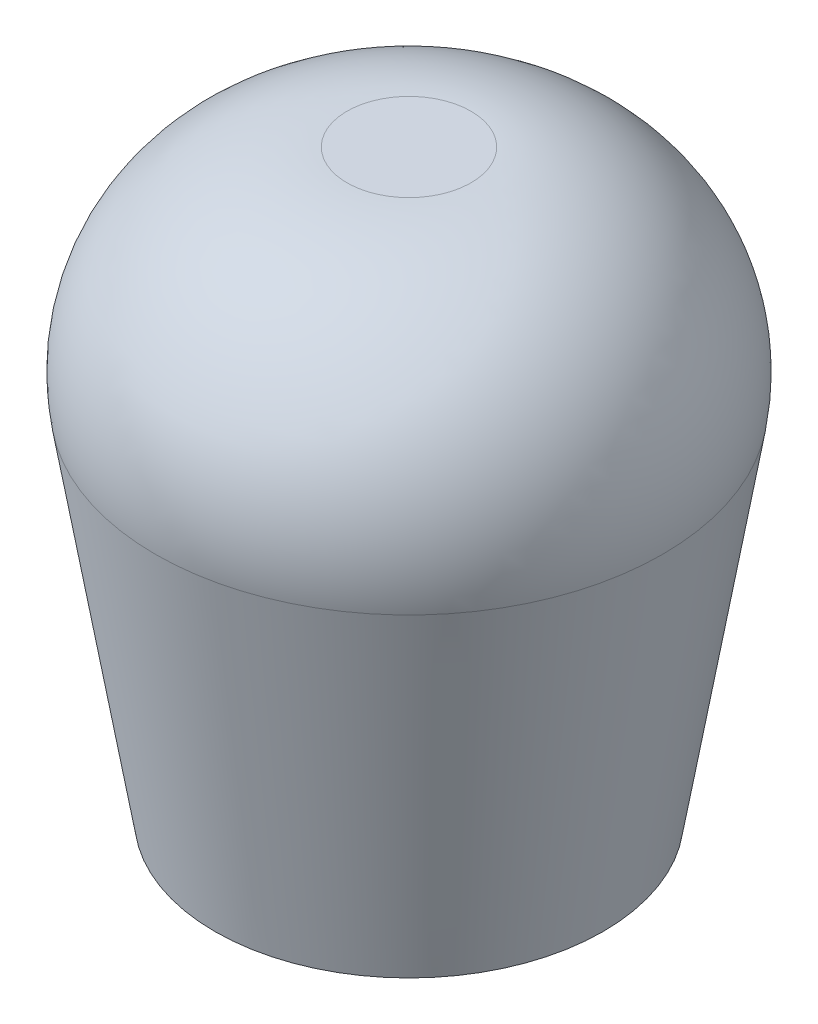
ISO-10303-21;
HEADER;
FILE_DESCRIPTION(('STEP AP214'),'2;1');
FILE_NAME('part.step','',(''),(''),'','','');
FILE_SCHEMA(('AUTOMOTIVE_DESIGN { 1 0 10303 214 1 1 1 1 }'));
ENDSEC;
DATA;
#1=APPLICATION_CONTEXT('core data for automotive mechanical design processes');
#2=APPLICATION_PROTOCOL_DEFINITION('international standard','automotive_design',2000,#1);
#3=PRODUCT_CONTEXT('',#1,'mechanical');
#4=PRODUCT('Part','Part','',(#3));
#5=PRODUCT_RELATED_PRODUCT_CATEGORY('part','',(#4));
#6=PRODUCT_DEFINITION_FORMATION('','',#4);
#7=PRODUCT_DEFINITION_CONTEXT('part definition',#1,'design');
#8=PRODUCT_DEFINITION('design','',#6,#7);
#9=PRODUCT_DEFINITION_SHAPE('','',#8);
#10=(LENGTH_UNIT() NAMED_UNIT(*) SI_UNIT(.MILLI.,.METRE.));
#11=(NAMED_UNIT(*) PLANE_ANGLE_UNIT() SI_UNIT($,.RADIAN.));
#12=(NAMED_UNIT(*) SI_UNIT($,.STERADIAN.) SOLID_ANGLE_UNIT());
#13=UNCERTAINTY_MEASURE_WITH_UNIT(LENGTH_MEASURE(1.E-05),#10,'distance_accuracy_value','');
#14=(GEOMETRIC_REPRESENTATION_CONTEXT(3) GLOBAL_UNCERTAINTY_ASSIGNED_CONTEXT((#13)) GLOBAL_UNIT_ASSIGNED_CONTEXT((#10,
#11,#12)) REPRESENTATION_CONTEXT('',''));
#15=CARTESIAN_POINT('',(0.,0.,0.));
#16=DIRECTION('',(0.,0.,1.));
#17=DIRECTION('',(1.,0.,0.));
#18=AXIS2_PLACEMENT_3D('',#15,#16,#17);
#19=CARTESIAN_POINT('',(0.,0.,0.));
#20=DIRECTION('',(0.,1.,0.));
#21=DIRECTION('',(0.,0.,1.));
#22=AXIS2_PLACEMENT_3D('',#19,#20,#21);
#23=CONICAL_SURFACE('',#22,15.,0.165148677414627);
#24=CARTESIAN_POINT('',(0.,27.5340151904196,0.));
#25=DIRECTION('',(0.,1.,0.));
#26=DIRECTION('',(0.,0.,1.));
#27=AXIS2_PLACEMENT_3D('',#24,#25,#26);
#28=CIRCLE('',#27,19.5890025317366);
#29=CARTESIAN_POINT('',(0.,27.5340151904196,19.5890025317366));
#30=VERTEX_POINT('',#29);
#31=EDGE_CURVE('E66',#30,#30,#28,.F.);
#32=ORIENTED_EDGE('',*,*,#31,.T.);
#33=EDGE_LOOP('',(#32));
#34=FACE_BOUND('',#33,.T.);
#35=CARTESIAN_POINT('',(0.,0.,0.));
#36=DIRECTION('',(0.,1.,0.));
#37=DIRECTION('',(0.,0.,1.));
#38=AXIS2_PLACEMENT_3D('',#35,#36,#37);
#39=CIRCLE('',#38,15.);
#40=CARTESIAN_POINT('',(0.,0.,15.));
#41=VERTEX_POINT('',#40);
#42=EDGE_CURVE('E70',#41,#41,#39,.F.);
#43=ORIENTED_EDGE('',*,*,#42,.F.);
#44=EDGE_LOOP('',(#43));
#45=FACE_BOUND('',#44,.T.);
#46=ADVANCED_FACE('F59',(#34,#45),#23,.T.);
#47=CARTESIAN_POINT('',(0.,45.,0.));
#48=DIRECTION('',(0.,-1.,0.));
#49=DIRECTION('',(0.,0.,-1.));
#50=AXIS2_PLACEMENT_3D('',#47,#48,#49);
#51=PLANE('',#50);
#52=CARTESIAN_POINT('',(0.,45.,0.));
#53=DIRECTION('',(0.,-1.,0.));
#54=DIRECTION('',(0.,0.,-1.));
#55=AXIS2_PLACEMENT_3D('',#52,#53,#54);
#56=CIRCLE('',#55,4.79309367425445);
#57=CARTESIAN_POINT('',(0.,45.,-4.79309367425445));
#58=VERTEX_POINT('',#57);
#59=EDGE_CURVE('E11',#58,#58,#56,.F.);
#60=ORIENTED_EDGE('',*,*,#59,.T.);
#61=EDGE_LOOP('',(#60));
#62=FACE_BOUND('',#61,.T.);
#63=ADVANCED_FACE('F92',(#62),#51,.F.);
#64=CARTESIAN_POINT('',(0.,0.,0.));
#65=DIRECTION('',(0.,-1.,0.));
#66=DIRECTION('',(0.,0.,-1.));
#67=AXIS2_PLACEMENT_3D('',#64,#65,#66);
#68=PLANE('',#67);
#69=CARTESIAN_POINT('',(0.,0.,0.));
#70=DIRECTION('',(0.,-1.,0.));
#71=DIRECTION('',(0.,0.,-1.));
#72=AXIS2_PLACEMENT_3D('',#69,#70,#71);
#73=CIRCLE('',#72,7.5);
#74=CARTESIAN_POINT('',(0.,0.,-7.5));
#75=VERTEX_POINT('',#74);
#76=EDGE_CURVE('E110',#75,#75,#73,.T.);
#77=ORIENTED_EDGE('',*,*,#76,.F.);
#78=EDGE_LOOP('',(#77));
#79=FACE_BOUND('',#78,.T.);
#80=ORIENTED_EDGE('',*,*,#42,.T.);
#81=EDGE_LOOP('',(#80));
#82=FACE_BOUND('',#81,.T.);
#83=ADVANCED_FACE('F93',(#79,#82),#68,.T.);
#84=CARTESIAN_POINT('',(0.,3.,0.));
#85=DIRECTION('',(0.,-1.,0.));
#86=DIRECTION('',(0.,0.,-1.));
#87=AXIS2_PLACEMENT_3D('',#84,#85,#86);
#88=CYLINDRICAL_SURFACE('',#87,7.5);
#89=CARTESIAN_POINT('',(0.,3.,0.));
#90=DIRECTION('',(0.,-1.,0.));
#91=DIRECTION('',(0.,0.,-1.));
#92=AXIS2_PLACEMENT_3D('',#89,#90,#91);
#93=CIRCLE('',#92,7.5);
#94=CARTESIAN_POINT('',(0.,3.,-7.5));
#95=VERTEX_POINT('',#94);
#96=EDGE_CURVE('E74',#95,#95,#93,.T.);
#97=ORIENTED_EDGE('',*,*,#96,.F.);
#98=EDGE_LOOP('',(#97));
#99=FACE_BOUND('',#98,.T.);
#100=ORIENTED_EDGE('',*,*,#76,.T.);
#101=EDGE_LOOP('',(#100));
#102=FACE_BOUND('',#101,.T.);
#103=ADVANCED_FACE('F97',(#99,#102),#88,.F.);
#104=CARTESIAN_POINT('',(0.,3.,0.));
#105=DIRECTION('',(0.,-1.,0.));
#106=DIRECTION('',(0.,0.,-1.));
#107=AXIS2_PLACEMENT_3D('',#104,#105,#106);
#108=PLANE('',#107);
#109=ORIENTED_EDGE('',*,*,#96,.T.);
#110=EDGE_LOOP('',(#109));
#111=FACE_BOUND('',#110,.T.);
#112=ADVANCED_FACE('F116',(#111),#108,.T.);
#113=CARTESIAN_POINT('',(0.,30.,0.));
#114=DIRECTION('',(0.,-1.,0.));
#115=DIRECTION('',(0.,0.,-1.));
#116=AXIS2_PLACEMENT_3D('',#113,#114,#115);
#117=DEGENERATE_TOROIDAL_SURFACE('',#116,4.79309367425445,15.,.T.);
#118=ORIENTED_EDGE('',*,*,#59,.F.);
#119=EDGE_LOOP('',(#118));
#120=FACE_BOUND('',#119,.T.);
#121=ORIENTED_EDGE('',*,*,#31,.F.);
#122=EDGE_LOOP('',(#121));
#123=FACE_BOUND('',#122,.T.);
#124=ADVANCED_FACE('F61',(#120,#123),#117,.T.);
#125=CLOSED_SHELL('',(#46,#63,#83,#103,#112,#124));
#126=MANIFOLD_SOLID_BREP('B2',#125);
#127=ADVANCED_BREP_SHAPE_REPRESENTATION('',(#18,#126),#14);
#128=SHAPE_DEFINITION_REPRESENTATION(#9,#127);
ENDSEC;
END-ISO-10303-21;
